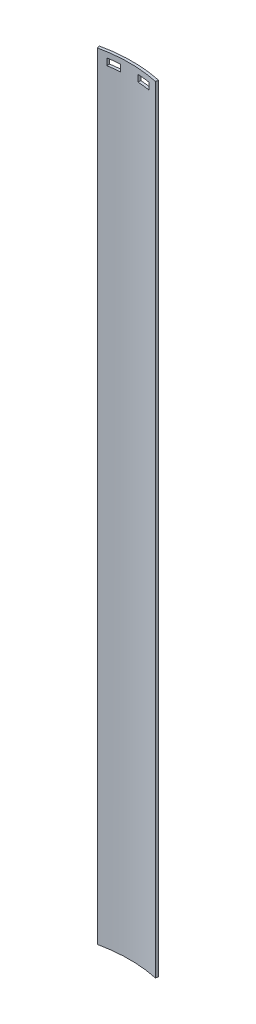
ISO-10303-21;
HEADER;
FILE_DESCRIPTION(('STEP AP214'),'2;1');
FILE_NAME('part.step','',(''),(''),'','','');
FILE_SCHEMA(('AUTOMOTIVE_DESIGN { 1 0 10303 214 1 1 1 1 }'));
ENDSEC;
DATA;
#1=APPLICATION_CONTEXT('core data for automotive mechanical design processes');
#2=APPLICATION_PROTOCOL_DEFINITION('international standard','automotive_design',2000,#1);
#3=PRODUCT_CONTEXT('',#1,'mechanical');
#4=PRODUCT('Part','Part','',(#3));
#5=PRODUCT_RELATED_PRODUCT_CATEGORY('part','',(#4));
#6=PRODUCT_DEFINITION_FORMATION('','',#4);
#7=PRODUCT_DEFINITION_CONTEXT('part definition',#1,'design');
#8=PRODUCT_DEFINITION('design','',#6,#7);
#9=PRODUCT_DEFINITION_SHAPE('','',#8);
#10=(LENGTH_UNIT() NAMED_UNIT(*) SI_UNIT(.MILLI.,.METRE.));
#11=(NAMED_UNIT(*) PLANE_ANGLE_UNIT() SI_UNIT($,.RADIAN.));
#12=(NAMED_UNIT(*) SI_UNIT($,.STERADIAN.) SOLID_ANGLE_UNIT());
#13=UNCERTAINTY_MEASURE_WITH_UNIT(LENGTH_MEASURE(1.E-05),#10,'distance_accuracy_value','');
#14=(GEOMETRIC_REPRESENTATION_CONTEXT(3) GLOBAL_UNCERTAINTY_ASSIGNED_CONTEXT((#13)) GLOBAL_UNIT_ASSIGNED_CONTEXT((#10,
#11,#12)) REPRESENTATION_CONTEXT('',''));
#15=CARTESIAN_POINT('',(0.,0.,0.));
#16=DIRECTION('',(0.,0.,1.));
#17=DIRECTION('',(1.,0.,0.));
#18=AXIS2_PLACEMENT_3D('',#15,#16,#17);
#19=CARTESIAN_POINT('',(0.,720.,254.132521402993));
#20=DIRECTION('',(0.,-1.,0.));
#21=DIRECTION('',(0.,0.,-1.));
#22=AXIS2_PLACEMENT_3D('',#19,#20,#21);
#23=CYLINDRICAL_SURFACE('',#22,260.);
#24=CARTESIAN_POINT('',(0.,710.,254.132521402993));
#25=DIRECTION('',(0.,1.,0.));
#26=DIRECTION('',(0.,0.,1.));
#27=AXIS2_PLACEMENT_3D('',#24,#25,#26);
#28=CIRCLE('',#27,260.);
#29=CARTESIAN_POINT('',(-16.4423076923077,710.,-5.3470548987869));
#30=VERTEX_POINT('',#29);
#31=CARTESIAN_POINT('',(-38.9423076923077,710.,-2.93458398312474));
#32=VERTEX_POINT('',#31);
#33=EDGE_CURVE('E231',#30,#32,#28,.T.);
#34=ORIENTED_EDGE('',*,*,#33,.T.);
#35=DIRECTION('',(0.,-1.,0.));
#36=VECTOR('',#35,1.);
#37=CARTESIAN_POINT('',(-38.9423076923077,720.,-2.93458398312474));
#38=LINE('',#37,#36);
#39=CARTESIAN_POINT('',(-38.9423076923077,697.5,-2.93458398312474));
#40=VERTEX_POINT('',#39);
#41=EDGE_CURVE('E191',#32,#40,#38,.T.);
#42=ORIENTED_EDGE('',*,*,#41,.T.);
#43=CARTESIAN_POINT('',(0.,697.5,254.132521402993));
#44=DIRECTION('',(0.,-1.,0.));
#45=DIRECTION('',(1.,0.,0.));
#46=AXIS2_PLACEMENT_3D('',#43,#44,#45);
#47=CIRCLE('',#46,260.);
#48=CARTESIAN_POINT('',(-16.4423076923077,697.5,-5.3470548987869));
#49=VERTEX_POINT('',#48);
#50=EDGE_CURVE('E223',#40,#49,#47,.T.);
#51=ORIENTED_EDGE('',*,*,#50,.T.);
#52=DIRECTION('',(0.,-1.,0.));
#53=VECTOR('',#52,1.);
#54=CARTESIAN_POINT('',(-16.4423076923077,720.,-5.3470548987869));
#55=LINE('',#54,#53);
#56=EDGE_CURVE('E227',#49,#30,#55,.F.);
#57=ORIENTED_EDGE('',*,*,#56,.T.);
#58=EDGE_LOOP('',(#34,#42,#51,#57));
#59=FACE_BOUND('',#58,.T.);
#60=DIRECTION('',(0.,-1.,0.));
#61=VECTOR('',#60,1.);
#62=CARTESIAN_POINT('',(38.9423076923077,720.,-2.93458398312474));
#63=LINE('',#62,#61);
#64=CARTESIAN_POINT('',(38.9423076923077,697.5,-2.93458398312474));
#65=VERTEX_POINT('',#64);
#66=CARTESIAN_POINT('',(38.9423076923077,710.,-2.93458398312474));
#67=VERTEX_POINT('',#66);
#68=EDGE_CURVE('E215',#65,#67,#63,.F.);
#69=ORIENTED_EDGE('',*,*,#68,.T.);
#70=CARTESIAN_POINT('',(0.,710.,254.132521402993));
#71=DIRECTION('',(0.,1.,0.));
#72=DIRECTION('',(0.,0.,1.));
#73=AXIS2_PLACEMENT_3D('',#70,#71,#72);
#74=CIRCLE('',#73,260.);
#75=CARTESIAN_POINT('',(16.4423076923077,710.,-5.3470548987869));
#76=VERTEX_POINT('',#75);
#77=EDGE_CURVE('E219',#67,#76,#74,.T.);
#78=ORIENTED_EDGE('',*,*,#77,.T.);
#79=DIRECTION('',(0.,-1.,0.));
#80=VECTOR('',#79,1.);
#81=CARTESIAN_POINT('',(16.4423076923077,720.,-5.3470548987869));
#82=LINE('',#81,#80);
#83=CARTESIAN_POINT('',(16.4423076923077,697.5,-5.3470548987869));
#84=VERTEX_POINT('',#83);
#85=EDGE_CURVE('E193',#76,#84,#82,.T.);
#86=ORIENTED_EDGE('',*,*,#85,.T.);
#87=CARTESIAN_POINT('',(0.,697.5,254.132521402993));
#88=DIRECTION('',(0.,-1.,0.));
#89=DIRECTION('',(1.,0.,0.));
#90=AXIS2_PLACEMENT_3D('',#87,#88,#89);
#91=CIRCLE('',#90,260.);
#92=EDGE_CURVE('E149',#84,#65,#91,.T.);
#93=ORIENTED_EDGE('',*,*,#92,.T.);
#94=EDGE_LOOP('',(#69,#78,#86,#93));
#95=FACE_BOUND('',#94,.T.);
#96=CARTESIAN_POINT('',(0.,-720.,254.132521402993));
#97=DIRECTION('',(0.,1.,0.));
#98=DIRECTION('',(0.,0.,-1.));
#99=AXIS2_PLACEMENT_3D('',#96,#97,#98);
#100=CIRCLE('',#99,260.);
#101=CARTESIAN_POINT('',(55.,-720.,0.016406211532205));
#102=VERTEX_POINT('',#101);
#103=CARTESIAN_POINT('',(-55.,-720.,0.016406211532205));
#104=VERTEX_POINT('',#103);
#105=EDGE_CURVE('E236',#102,#104,#100,.T.);
#106=ORIENTED_EDGE('',*,*,#105,.T.);
#107=DIRECTION('',(0.,-1.,0.));
#108=VECTOR('',#107,1.);
#109=CARTESIAN_POINT('',(-55.,720.,0.016406211532205));
#110=LINE('',#109,#108);
#111=CARTESIAN_POINT('',(-55.,720.,0.016406211532205));
#112=VERTEX_POINT('',#111);
#113=EDGE_CURVE('E142',#112,#104,#110,.T.);
#114=ORIENTED_EDGE('',*,*,#113,.F.);
#115=CARTESIAN_POINT('',(0.,720.,254.132521402993));
#116=DIRECTION('',(0.,1.,0.));
#117=DIRECTION('',(0.,0.,-1.));
#118=AXIS2_PLACEMENT_3D('',#115,#116,#117);
#119=CIRCLE('',#118,260.);
#120=CARTESIAN_POINT('',(55.,720.,0.016406211532205));
#121=VERTEX_POINT('',#120);
#122=EDGE_CURVE('E237',#121,#112,#119,.T.);
#123=ORIENTED_EDGE('',*,*,#122,.F.);
#124=DIRECTION('',(0.,-1.,0.));
#125=VECTOR('',#124,1.);
#126=CARTESIAN_POINT('',(55.,720.,0.016406211532205));
#127=LINE('',#126,#125);
#128=EDGE_CURVE('E251',#121,#102,#127,.T.);
#129=ORIENTED_EDGE('',*,*,#128,.T.);
#130=EDGE_LOOP('',(#106,#114,#123,#129));
#131=FACE_BOUND('',#130,.T.);
#132=ADVANCED_FACE('F45',(#59,#95,#131),#23,.T.);
#133=CARTESIAN_POINT('',(-55.,720.,0.016406211532205));
#134=DIRECTION('',(0.977369673813313,0.,-0.211538461538459));
#135=DIRECTION('',(-0.21153846153846,0.,-0.977369673813313));
#136=AXIS2_PLACEMENT_3D('',#133,#134,#135);
#137=PLANE('',#136);
#138=DIRECTION('',(0.211538461538459,0.,0.977369673813313));
#139=VECTOR('',#138,1.);
#140=CARTESIAN_POINT('',(-55.,-720.,0.016406211532205));
#141=LINE('',#140,#139);
#142=CARTESIAN_POINT('',(-53.9423076923077,-720.,4.90325458059879));
#143=VERTEX_POINT('',#142);
#144=EDGE_CURVE('E255',#104,#143,#141,.T.);
#145=ORIENTED_EDGE('',*,*,#144,.T.);
#146=DIRECTION('',(0.,-1.,0.));
#147=VECTOR('',#146,1.);
#148=CARTESIAN_POINT('',(-53.9423076923077,720.,4.90325458059879));
#149=LINE('',#148,#147);
#150=CARTESIAN_POINT('',(-53.9423076923077,720.,4.90325458059879));
#151=VERTEX_POINT('',#150);
#152=EDGE_CURVE('E270',#151,#143,#149,.T.);
#153=ORIENTED_EDGE('',*,*,#152,.F.);
#154=DIRECTION('',(0.211538461538459,0.,0.977369673813313));
#155=VECTOR('',#154,1.);
#156=CARTESIAN_POINT('',(-55.,720.,0.016406211532205));
#157=LINE('',#156,#155);
#158=EDGE_CURVE('E241',#112,#151,#157,.T.);
#159=ORIENTED_EDGE('',*,*,#158,.F.);
#160=ORIENTED_EDGE('',*,*,#113,.T.);
#161=EDGE_LOOP('',(#145,#153,#159,#160));
#162=FACE_BOUND('',#161,.T.);
#163=ADVANCED_FACE('F277',(#162),#137,.F.);
#164=CARTESIAN_POINT('',(0.,720.,254.132521402993));
#165=DIRECTION('',(0.,-1.,0.));
#166=DIRECTION('',(0.,0.,-1.));
#167=AXIS2_PLACEMENT_3D('',#164,#165,#166);
#168=CYLINDRICAL_SURFACE('',#167,255.);
#169=CARTESIAN_POINT('',(0.,697.5,254.132521402993));
#170=DIRECTION('',(0.,-1.,0.));
#171=DIRECTION('',(1.,0.,0.));
#172=AXIS2_PLACEMENT_3D('',#169,#170,#171);
#173=CIRCLE('',#172,255.);
#174=CARTESIAN_POINT('',(-16.4423076923077,697.5,-0.336829438618569));
#175=VERTEX_POINT('',#174);
#176=CARTESIAN_POINT('',(-38.9423076923077,697.5,2.1235995934718));
#177=VERTEX_POINT('',#176);
#178=EDGE_CURVE('E167',#175,#177,#173,.F.);
#179=ORIENTED_EDGE('',*,*,#178,.T.);
#180=DIRECTION('',(0.,-1.,0.));
#181=VECTOR('',#180,1.);
#182=CARTESIAN_POINT('',(-38.9423076923077,720.,2.1235995934718));
#183=LINE('',#182,#181);
#184=CARTESIAN_POINT('',(-38.9423076923077,710.,2.1235995934718));
#185=VERTEX_POINT('',#184);
#186=EDGE_CURVE('E11',#177,#185,#183,.F.);
#187=ORIENTED_EDGE('',*,*,#186,.T.);
#188=CARTESIAN_POINT('',(0.,710.,254.132521402993));
#189=DIRECTION('',(0.,1.,0.));
#190=DIRECTION('',(0.,0.,1.));
#191=AXIS2_PLACEMENT_3D('',#188,#189,#190);
#192=CIRCLE('',#191,255.);
#193=CARTESIAN_POINT('',(-16.4423076923077,710.,-0.336829438618571));
#194=VERTEX_POINT('',#193);
#195=EDGE_CURVE('E53',#185,#194,#192,.F.);
#196=ORIENTED_EDGE('',*,*,#195,.T.);
#197=DIRECTION('',(0.,-1.,0.));
#198=VECTOR('',#197,1.);
#199=CARTESIAN_POINT('',(-16.4423076923077,720.,-0.336829438618569));
#200=LINE('',#199,#198);
#201=EDGE_CURVE('E171',#194,#175,#200,.T.);
#202=ORIENTED_EDGE('',*,*,#201,.T.);
#203=EDGE_LOOP('',(#179,#187,#196,#202));
#204=FACE_BOUND('',#203,.T.);
#205=DIRECTION('',(0.,-1.,0.));
#206=VECTOR('',#205,1.);
#207=CARTESIAN_POINT('',(16.4423076923077,720.,-0.336829438618569));
#208=LINE('',#207,#206);
#209=CARTESIAN_POINT('',(16.4423076923077,697.5,-0.336829438618571));
#210=VERTEX_POINT('',#209);
#211=CARTESIAN_POINT('',(16.4423076923077,710.,-0.336829438618569));
#212=VERTEX_POINT('',#211);
#213=EDGE_CURVE('E132',#210,#212,#208,.F.);
#214=ORIENTED_EDGE('',*,*,#213,.T.);
#215=CARTESIAN_POINT('',(0.,710.,254.132521402993));
#216=DIRECTION('',(0.,1.,0.));
#217=DIRECTION('',(0.,0.,1.));
#218=AXIS2_PLACEMENT_3D('',#215,#216,#217);
#219=CIRCLE('',#218,255.);
#220=CARTESIAN_POINT('',(38.9423076923077,710.,2.1235995934718));
#221=VERTEX_POINT('',#220);
#222=EDGE_CURVE('E161',#212,#221,#219,.F.);
#223=ORIENTED_EDGE('',*,*,#222,.T.);
#224=DIRECTION('',(0.,-1.,0.));
#225=VECTOR('',#224,1.);
#226=CARTESIAN_POINT('',(38.9423076923077,720.,2.1235995934718));
#227=LINE('',#226,#225);
#228=CARTESIAN_POINT('',(38.9423076923077,697.5,2.1235995934718));
#229=VERTEX_POINT('',#228);
#230=EDGE_CURVE('E157',#221,#229,#227,.T.);
#231=ORIENTED_EDGE('',*,*,#230,.T.);
#232=CARTESIAN_POINT('',(0.,697.5,254.132521402993));
#233=DIRECTION('',(0.,-1.,0.));
#234=DIRECTION('',(1.,0.,0.));
#235=AXIS2_PLACEMENT_3D('',#232,#233,#234);
#236=CIRCLE('',#235,255.);
#237=EDGE_CURVE('E141',#229,#210,#236,.F.);
#238=ORIENTED_EDGE('',*,*,#237,.T.);
#239=EDGE_LOOP('',(#214,#223,#231,#238));
#240=FACE_BOUND('',#239,.T.);
#241=CARTESIAN_POINT('',(0.,-720.,254.132521402993));
#242=DIRECTION('',(0.,-1.,0.));
#243=DIRECTION('',(0.,0.,-1.));
#244=AXIS2_PLACEMENT_3D('',#241,#242,#243);
#245=CIRCLE('',#244,255.);
#246=CARTESIAN_POINT('',(53.9423076923078,-720.,4.90325458059881));
#247=VERTEX_POINT('',#246);
#248=EDGE_CURVE('E258',#143,#247,#245,.T.);
#249=ORIENTED_EDGE('',*,*,#248,.T.);
#250=DIRECTION('',(0.,-1.,0.));
#251=VECTOR('',#250,1.);
#252=CARTESIAN_POINT('',(53.9423076923078,720.,4.90325458059881));
#253=LINE('',#252,#251);
#254=CARTESIAN_POINT('',(53.9423076923078,720.,4.90325458059881));
#255=VERTEX_POINT('',#254);
#256=EDGE_CURVE('E266',#255,#247,#253,.T.);
#257=ORIENTED_EDGE('',*,*,#256,.F.);
#258=CARTESIAN_POINT('',(0.,720.,254.132521402993));
#259=DIRECTION('',(0.,-1.,0.));
#260=DIRECTION('',(0.,0.,-1.));
#261=AXIS2_PLACEMENT_3D('',#258,#259,#260);
#262=CIRCLE('',#261,255.);
#263=EDGE_CURVE('E245',#151,#255,#262,.T.);
#264=ORIENTED_EDGE('',*,*,#263,.F.);
#265=ORIENTED_EDGE('',*,*,#152,.T.);
#266=EDGE_LOOP('',(#249,#257,#264,#265));
#267=FACE_BOUND('',#266,.T.);
#268=ADVANCED_FACE('F155',(#204,#240,#267),#168,.F.);
#269=CARTESIAN_POINT('',(53.9423076923077,720.,4.90325458059879));
#270=DIRECTION('',(-0.977369673813312,0.,-0.211538461538463));
#271=DIRECTION('',(-0.211538461538463,0.,0.977369673813312));
#272=AXIS2_PLACEMENT_3D('',#269,#270,#271);
#273=PLANE('',#272);
#274=DIRECTION('',(0.211538461538463,0.,-0.977369673813312));
#275=VECTOR('',#274,1.);
#276=CARTESIAN_POINT('',(53.9423076923077,-720.,4.90325458059879));
#277=LINE('',#276,#275);
#278=EDGE_CURVE('E242',#247,#102,#277,.T.);
#279=ORIENTED_EDGE('',*,*,#278,.T.);
#280=ORIENTED_EDGE('',*,*,#128,.F.);
#281=DIRECTION('',(0.211538461538463,0.,-0.977369673813312));
#282=VECTOR('',#281,1.);
#283=CARTESIAN_POINT('',(53.9423076923077,720.,4.90325458059879));
#284=LINE('',#283,#282);
#285=EDGE_CURVE('E248',#255,#121,#284,.T.);
#286=ORIENTED_EDGE('',*,*,#285,.F.);
#287=ORIENTED_EDGE('',*,*,#256,.T.);
#288=EDGE_LOOP('',(#279,#280,#286,#287));
#289=FACE_BOUND('',#288,.T.);
#290=ADVANCED_FACE('F291',(#289),#273,.F.);
#291=CARTESIAN_POINT('',(0.,720.,254.132521402993));
#292=DIRECTION('',(0.,-1.,0.));
#293=DIRECTION('',(0.,0.,-1.));
#294=AXIS2_PLACEMENT_3D('',#291,#292,#293);
#295=PLANE('',#294);
#296=ORIENTED_EDGE('',*,*,#122,.T.);
#297=ORIENTED_EDGE('',*,*,#158,.T.);
#298=ORIENTED_EDGE('',*,*,#263,.T.);
#299=ORIENTED_EDGE('',*,*,#285,.T.);
#300=EDGE_LOOP('',(#296,#297,#298,#299));
#301=FACE_BOUND('',#300,.T.);
#302=ADVANCED_FACE('F293',(#301),#295,.F.);
#303=CARTESIAN_POINT('',(0.,-720.,254.132521402993));
#304=DIRECTION('',(0.,-1.,0.));
#305=DIRECTION('',(0.,0.,-1.));
#306=AXIS2_PLACEMENT_3D('',#303,#304,#305);
#307=PLANE('',#306);
#308=ORIENTED_EDGE('',*,*,#105,.F.);
#309=ORIENTED_EDGE('',*,*,#278,.F.);
#310=ORIENTED_EDGE('',*,*,#248,.F.);
#311=ORIENTED_EDGE('',*,*,#144,.F.);
#312=EDGE_LOOP('',(#308,#309,#310,#311));
#313=FACE_BOUND('',#312,.T.);
#314=ADVANCED_FACE('F285',(#313),#307,.T.);
#315=CARTESIAN_POINT('',(16.4423076923077,710.,-5.86747859700654));
#316=DIRECTION('',(0.,1.,0.));
#317=DIRECTION('',(0.,0.,1.));
#318=AXIS2_PLACEMENT_3D('',#315,#316,#317);
#319=PLANE('',#318);
#320=DIRECTION('',(0.,0.,1.));
#321=VECTOR('',#320,1.);
#322=CARTESIAN_POINT('',(38.9423076923077,710.,-5.86747859700654));
#323=LINE('',#322,#321);
#324=EDGE_CURVE('E209',#67,#221,#323,.T.);
#325=ORIENTED_EDGE('',*,*,#324,.T.);
#326=ORIENTED_EDGE('',*,*,#222,.F.);
#327=DIRECTION('',(0.,0.,1.));
#328=VECTOR('',#327,1.);
#329=CARTESIAN_POINT('',(16.4423076923077,710.,-5.86747859700654));
#330=LINE('',#329,#328);
#331=EDGE_CURVE('E135',#76,#212,#330,.T.);
#332=ORIENTED_EDGE('',*,*,#331,.F.);
#333=ORIENTED_EDGE('',*,*,#77,.F.);
#334=EDGE_LOOP('',(#325,#326,#332,#333));
#335=FACE_BOUND('',#334,.T.);
#336=ADVANCED_FACE('F300',(#335),#319,.F.);
#337=CARTESIAN_POINT('',(38.9423076923077,710.,-5.86747859700654));
#338=DIRECTION('',(1.,0.,0.));
#339=DIRECTION('',(0.,1.,0.));
#340=AXIS2_PLACEMENT_3D('',#337,#338,#339);
#341=PLANE('',#340);
#342=DIRECTION('',(0.,0.,1.));
#343=VECTOR('',#342,1.);
#344=CARTESIAN_POINT('',(38.9423076923077,697.5,-5.86747859700654));
#345=LINE('',#344,#343);
#346=EDGE_CURVE('E152',#65,#229,#345,.T.);
#347=ORIENTED_EDGE('',*,*,#346,.T.);
#348=ORIENTED_EDGE('',*,*,#230,.F.);
#349=ORIENTED_EDGE('',*,*,#324,.F.);
#350=ORIENTED_EDGE('',*,*,#68,.F.);
#351=EDGE_LOOP('',(#347,#348,#349,#350));
#352=FACE_BOUND('',#351,.T.);
#353=ADVANCED_FACE('F313',(#352),#341,.F.);
#354=CARTESIAN_POINT('',(16.4423076923077,697.5,-5.86747859700654));
#355=DIRECTION('',(0.,-1.,0.));
#356=DIRECTION('',(1.,0.,0.));
#357=AXIS2_PLACEMENT_3D('',#354,#355,#356);
#358=PLANE('',#357);
#359=DIRECTION('',(0.,0.,1.));
#360=VECTOR('',#359,1.);
#361=CARTESIAN_POINT('',(16.4423076923077,697.5,-5.86747859700654));
#362=LINE('',#361,#360);
#363=EDGE_CURVE('E68',#84,#210,#362,.T.);
#364=ORIENTED_EDGE('',*,*,#363,.T.);
#365=ORIENTED_EDGE('',*,*,#237,.F.);
#366=ORIENTED_EDGE('',*,*,#346,.F.);
#367=ORIENTED_EDGE('',*,*,#92,.F.);
#368=EDGE_LOOP('',(#364,#365,#366,#367));
#369=FACE_BOUND('',#368,.T.);
#370=ADVANCED_FACE('F145',(#369),#358,.F.);
#371=CARTESIAN_POINT('',(16.4423076923077,710.,-5.86747859700654));
#372=DIRECTION('',(-1.,0.,0.));
#373=DIRECTION('',(0.,-1.,0.));
#374=AXIS2_PLACEMENT_3D('',#371,#372,#373);
#375=PLANE('',#374);
#376=ORIENTED_EDGE('',*,*,#331,.T.);
#377=ORIENTED_EDGE('',*,*,#213,.F.);
#378=ORIENTED_EDGE('',*,*,#363,.F.);
#379=ORIENTED_EDGE('',*,*,#85,.F.);
#380=EDGE_LOOP('',(#376,#377,#378,#379));
#381=FACE_BOUND('',#380,.T.);
#382=ADVANCED_FACE('F133',(#381),#375,.F.);
#383=CARTESIAN_POINT('',(-38.9423076923077,710.,-5.86747859700654));
#384=DIRECTION('',(-1.,0.,0.));
#385=DIRECTION('',(0.,-1.,0.));
#386=AXIS2_PLACEMENT_3D('',#383,#384,#385);
#387=PLANE('',#386);
#388=DIRECTION('',(0.,0.,1.));
#389=VECTOR('',#388,1.);
#390=CARTESIAN_POINT('',(-38.9423076923077,710.,-5.86747859700654));
#391=LINE('',#390,#389);
#392=EDGE_CURVE('E183',#32,#185,#391,.T.);
#393=ORIENTED_EDGE('',*,*,#392,.T.);
#394=ORIENTED_EDGE('',*,*,#186,.F.);
#395=DIRECTION('',(0.,0.,1.));
#396=VECTOR('',#395,1.);
#397=CARTESIAN_POINT('',(-38.9423076923077,697.5,-5.86747859700654));
#398=LINE('',#397,#396);
#399=EDGE_CURVE('E202',#40,#177,#398,.T.);
#400=ORIENTED_EDGE('',*,*,#399,.F.);
#401=ORIENTED_EDGE('',*,*,#41,.F.);
#402=EDGE_LOOP('',(#393,#394,#400,#401));
#403=FACE_BOUND('',#402,.T.);
#404=ADVANCED_FACE('F188',(#403),#387,.F.);
#405=CARTESIAN_POINT('',(-16.4423076923077,710.,-5.86747859700654));
#406=DIRECTION('',(0.,1.,0.));
#407=DIRECTION('',(0.,0.,1.));
#408=AXIS2_PLACEMENT_3D('',#405,#406,#407);
#409=PLANE('',#408);
#410=DIRECTION('',(0.,0.,1.));
#411=VECTOR('',#410,1.);
#412=CARTESIAN_POINT('',(-16.4423076923077,710.,-5.86747859700654));
#413=LINE('',#412,#411);
#414=EDGE_CURVE('E186',#30,#194,#413,.T.);
#415=ORIENTED_EDGE('',*,*,#414,.T.);
#416=ORIENTED_EDGE('',*,*,#195,.F.);
#417=ORIENTED_EDGE('',*,*,#392,.F.);
#418=ORIENTED_EDGE('',*,*,#33,.F.);
#419=EDGE_LOOP('',(#415,#416,#417,#418));
#420=FACE_BOUND('',#419,.T.);
#421=ADVANCED_FACE('F182',(#420),#409,.F.);
#422=CARTESIAN_POINT('',(-16.4423076923077,710.,-5.86747859700654));
#423=DIRECTION('',(1.,0.,0.));
#424=DIRECTION('',(0.,1.,0.));
#425=AXIS2_PLACEMENT_3D('',#422,#423,#424);
#426=PLANE('',#425);
#427=DIRECTION('',(0.,0.,1.));
#428=VECTOR('',#427,1.);
#429=CARTESIAN_POINT('',(-16.4423076923077,697.5,-5.86747859700654));
#430=LINE('',#429,#428);
#431=EDGE_CURVE('E60',#49,#175,#430,.T.);
#432=ORIENTED_EDGE('',*,*,#431,.T.);
#433=ORIENTED_EDGE('',*,*,#201,.F.);
#434=ORIENTED_EDGE('',*,*,#414,.F.);
#435=ORIENTED_EDGE('',*,*,#56,.F.);
#436=EDGE_LOOP('',(#432,#433,#434,#435));
#437=FACE_BOUND('',#436,.T.);
#438=ADVANCED_FACE('F348',(#437),#426,.F.);
#439=CARTESIAN_POINT('',(-16.4423076923077,697.5,-5.86747859700654));
#440=DIRECTION('',(0.,-1.,0.));
#441=DIRECTION('',(1.,0.,0.));
#442=AXIS2_PLACEMENT_3D('',#439,#440,#441);
#443=PLANE('',#442);
#444=ORIENTED_EDGE('',*,*,#399,.T.);
#445=ORIENTED_EDGE('',*,*,#178,.F.);
#446=ORIENTED_EDGE('',*,*,#431,.F.);
#447=ORIENTED_EDGE('',*,*,#50,.F.);
#448=EDGE_LOOP('',(#444,#445,#446,#447));
#449=FACE_BOUND('',#448,.T.);
#450=ADVANCED_FACE('F356',(#449),#443,.F.);
#451=CLOSED_SHELL('',(#132,#163,#268,#290,#302,#314,#336,#353,#370,#382,#404,#421,#438,#450));
#452=MANIFOLD_SOLID_BREP('B2',#451);
#453=ADVANCED_BREP_SHAPE_REPRESENTATION('',(#18,#452),#14);
#454=SHAPE_DEFINITION_REPRESENTATION(#9,#453);
ENDSEC;
END-ISO-10303-21;
